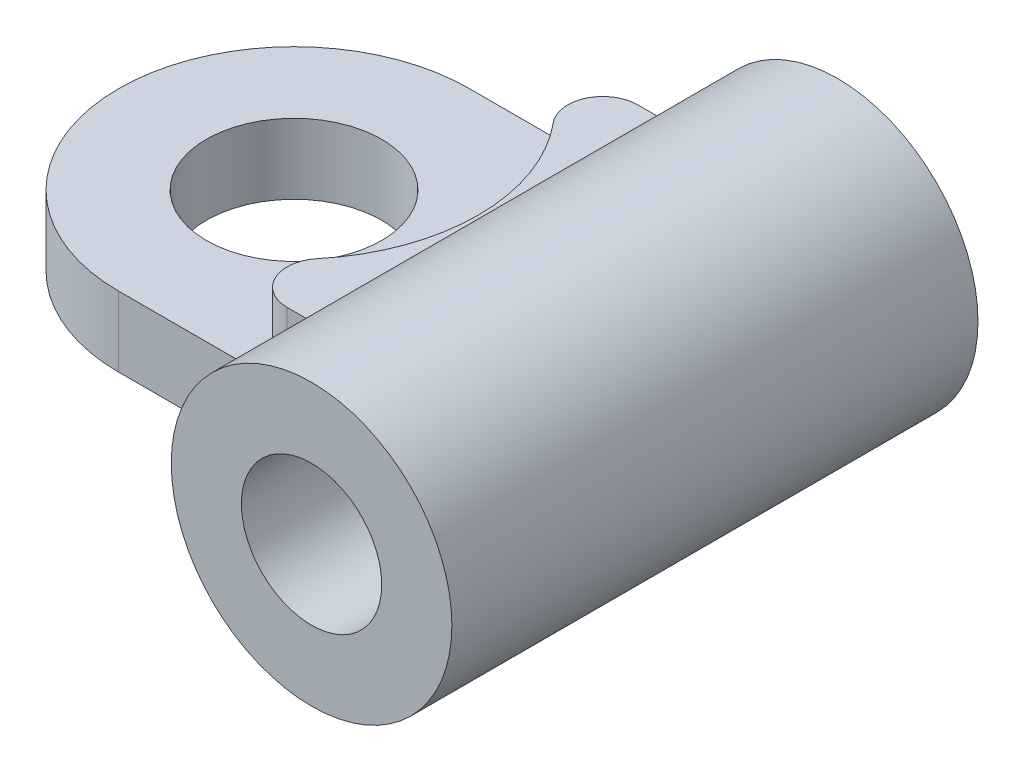
ISO-10303-21;
HEADER;
FILE_DESCRIPTION(('STEP AP214'),'2;1');
FILE_NAME('part.step','',(''),(''),'','','');
FILE_SCHEMA(('AUTOMOTIVE_DESIGN { 1 0 10303 214 1 1 1 1 }'));
ENDSEC;
DATA;
#1=APPLICATION_CONTEXT('core data for automotive mechanical design processes');
#2=APPLICATION_PROTOCOL_DEFINITION('international standard','automotive_design',2000,#1);
#3=PRODUCT_CONTEXT('',#1,'mechanical');
#4=PRODUCT('Part','Part','',(#3));
#5=PRODUCT_RELATED_PRODUCT_CATEGORY('part','',(#4));
#6=PRODUCT_DEFINITION_FORMATION('','',#4);
#7=PRODUCT_DEFINITION_CONTEXT('part definition',#1,'design');
#8=PRODUCT_DEFINITION('design','',#6,#7);
#9=PRODUCT_DEFINITION_SHAPE('','',#8);
#10=(LENGTH_UNIT() NAMED_UNIT(*) SI_UNIT(.MILLI.,.METRE.));
#11=(NAMED_UNIT(*) PLANE_ANGLE_UNIT() SI_UNIT($,.RADIAN.));
#12=(NAMED_UNIT(*) SI_UNIT($,.STERADIAN.) SOLID_ANGLE_UNIT());
#13=UNCERTAINTY_MEASURE_WITH_UNIT(LENGTH_MEASURE(1.E-05),#10,'distance_accuracy_value','');
#14=(GEOMETRIC_REPRESENTATION_CONTEXT(3) GLOBAL_UNCERTAINTY_ASSIGNED_CONTEXT((#13)) GLOBAL_UNIT_ASSIGNED_CONTEXT((#10,
#11,#12)) REPRESENTATION_CONTEXT('',''));
#15=CARTESIAN_POINT('',(0.,0.,0.));
#16=DIRECTION('',(0.,0.,1.));
#17=DIRECTION('',(1.,0.,0.));
#18=AXIS2_PLACEMENT_3D('',#15,#16,#17);
#19=CARTESIAN_POINT('',(-18.,4.,13.));
#20=DIRECTION('',(0.,-1.,0.));
#21=DIRECTION('',(0.,0.,-1.));
#22=AXIS2_PLACEMENT_3D('',#19,#20,#21);
#23=CYLINDRICAL_SURFACE('',#22,10.);
#24=CARTESIAN_POINT('',(-18.,0.,13.));
#25=DIRECTION('',(0.,1.,0.));
#26=DIRECTION('',(0.,0.,1.));
#27=AXIS2_PLACEMENT_3D('',#24,#25,#26);
#28=CIRCLE('',#27,10.);
#29=CARTESIAN_POINT('',(-18.,0.,3.));
#30=VERTEX_POINT('',#29);
#31=CARTESIAN_POINT('',(-18.,0.,23.));
#32=VERTEX_POINT('',#31);
#33=EDGE_CURVE('E111',#30,#32,#28,.T.);
#34=ORIENTED_EDGE('',*,*,#33,.F.);
#35=DIRECTION('',(0.,-1.,0.));
#36=VECTOR('',#35,1.);
#37=CARTESIAN_POINT('',(-18.,4.,3.));
#38=LINE('',#37,#36);
#39=CARTESIAN_POINT('',(-18.,-4.,3.));
#40=VERTEX_POINT('',#39);
#41=EDGE_CURVE('E120',#30,#40,#38,.T.);
#42=ORIENTED_EDGE('',*,*,#41,.T.);
#43=CARTESIAN_POINT('',(-18.,-4.,13.));
#44=DIRECTION('',(0.,1.,0.));
#45=DIRECTION('',(0.,0.,1.));
#46=AXIS2_PLACEMENT_3D('',#43,#44,#45);
#47=CIRCLE('',#46,10.);
#48=CARTESIAN_POINT('',(-18.,-4.,23.));
#49=VERTEX_POINT('',#48);
#50=EDGE_CURVE('E181',#40,#49,#47,.T.);
#51=ORIENTED_EDGE('',*,*,#50,.T.);
#52=DIRECTION('',(0.,-1.,0.));
#53=VECTOR('',#52,1.);
#54=CARTESIAN_POINT('',(-18.,4.,23.));
#55=LINE('',#54,#53);
#56=EDGE_CURVE('E115',#32,#49,#55,.T.);
#57=ORIENTED_EDGE('',*,*,#56,.F.);
#58=EDGE_LOOP('',(#34,#42,#51,#57));
#59=FACE_BOUND('',#58,.T.);
#60=ADVANCED_FACE('F48',(#59),#23,.T.);
#61=CARTESIAN_POINT('',(0.,4.,23.));
#62=DIRECTION('',(0.,0.,-1.));
#63=DIRECTION('',(-1.,0.,0.));
#64=AXIS2_PLACEMENT_3D('',#61,#62,#63);
#65=PLANE('',#64);
#66=DIRECTION('',(1.,0.,0.));
#67=VECTOR('',#66,1.);
#68=CARTESIAN_POINT('',(0.,4.,23.));
#69=LINE('',#68,#67);
#70=CARTESIAN_POINT('',(-8.39531364385073,4.,23.));
#71=VERTEX_POINT('',#70);
#72=CARTESIAN_POINT('',(-5.,4.,23.));
#73=VERTEX_POINT('',#72);
#74=EDGE_CURVE('E171',#71,#73,#69,.T.);
#75=ORIENTED_EDGE('',*,*,#74,.F.);
#76=DIRECTION('',(0.,1.,0.));
#77=VECTOR('',#76,1.);
#78=CARTESIAN_POINT('',(-8.39531364385073,4.,23.));
#79=LINE('',#78,#77);
#80=CARTESIAN_POINT('',(-8.39531364385073,0.,23.));
#81=VERTEX_POINT('',#80);
#82=EDGE_CURVE('E114',#71,#81,#79,.F.);
#83=ORIENTED_EDGE('',*,*,#82,.T.);
#84=DIRECTION('',(1.,0.,0.));
#85=VECTOR('',#84,1.);
#86=CARTESIAN_POINT('',(0.,0.,23.));
#87=LINE('',#86,#85);
#88=EDGE_CURVE('E122',#32,#81,#87,.T.);
#89=ORIENTED_EDGE('',*,*,#88,.F.);
#90=ORIENTED_EDGE('',*,*,#56,.T.);
#91=DIRECTION('',(1.,0.,0.));
#92=VECTOR('',#91,1.);
#93=CARTESIAN_POINT('',(0.,-4.,23.));
#94=LINE('',#93,#92);
#95=CARTESIAN_POINT('',(-5.,-4.,23.));
#96=VERTEX_POINT('',#95);
#97=EDGE_CURVE('E183',#49,#96,#94,.T.);
#98=ORIENTED_EDGE('',*,*,#97,.T.);
#99=DIRECTION('',(0.,-1.,0.));
#100=VECTOR('',#99,1.);
#101=CARTESIAN_POINT('',(-5.,4.,23.));
#102=LINE('',#101,#100);
#103=EDGE_CURVE('E132',#73,#96,#102,.T.);
#104=ORIENTED_EDGE('',*,*,#103,.F.);
#105=EDGE_LOOP('',(#75,#83,#89,#90,#98,#104));
#106=FACE_BOUND('',#105,.T.);
#107=ADVANCED_FACE('F174',(#106),#65,.F.);
#108=CARTESIAN_POINT('',(-5.,4.,0.));
#109=DIRECTION('',(-1.,0.,0.));
#110=DIRECTION('',(0.,0.,1.));
#111=AXIS2_PLACEMENT_3D('',#108,#109,#110);
#112=PLANE('',#111);
#113=DIRECTION('',(0.,0.,-1.));
#114=VECTOR('',#113,1.);
#115=CARTESIAN_POINT('',(-5.,-4.,0.));
#116=LINE('',#115,#114);
#117=CARTESIAN_POINT('',(-5.,-4.,3.));
#118=VERTEX_POINT('',#117);
#119=EDGE_CURVE('E178',#96,#118,#116,.T.);
#120=ORIENTED_EDGE('',*,*,#119,.T.);
#121=DIRECTION('',(0.,-1.,0.));
#122=VECTOR('',#121,1.);
#123=CARTESIAN_POINT('',(-5.,4.,3.));
#124=LINE('',#123,#122);
#125=CARTESIAN_POINT('',(-5.,4.,3.));
#126=VERTEX_POINT('',#125);
#127=EDGE_CURVE('E129',#126,#118,#124,.T.);
#128=ORIENTED_EDGE('',*,*,#127,.F.);
#129=DIRECTION('',(0.,0.,-1.));
#130=VECTOR('',#129,1.);
#131=CARTESIAN_POINT('',(-5.,4.,0.));
#132=LINE('',#131,#130);
#133=EDGE_CURVE('E134',#73,#126,#132,.T.);
#134=ORIENTED_EDGE('',*,*,#133,.F.);
#135=ORIENTED_EDGE('',*,*,#103,.T.);
#136=EDGE_LOOP('',(#120,#128,#134,#135));
#137=FACE_BOUND('',#136,.T.);
#138=ADVANCED_FACE('F188',(#137),#112,.F.);
#139=CARTESIAN_POINT('',(0.,4.,3.));
#140=DIRECTION('',(0.,0.,-1.));
#141=DIRECTION('',(-1.,0.,0.));
#142=AXIS2_PLACEMENT_3D('',#139,#140,#141);
#143=PLANE('',#142);
#144=DIRECTION('',(1.,0.,0.));
#145=VECTOR('',#144,1.);
#146=CARTESIAN_POINT('',(0.,0.,3.));
#147=LINE('',#146,#145);
#148=CARTESIAN_POINT('',(-8.39531364385073,0.,3.));
#149=VERTEX_POINT('',#148);
#150=EDGE_CURVE('E63',#30,#149,#147,.T.);
#151=ORIENTED_EDGE('',*,*,#150,.T.);
#152=DIRECTION('',(0.,-1.,0.));
#153=VECTOR('',#152,1.);
#154=CARTESIAN_POINT('',(-8.39531364385073,4.,3.));
#155=LINE('',#154,#153);
#156=CARTESIAN_POINT('',(-8.39531364385073,4.,3.));
#157=VERTEX_POINT('',#156);
#158=EDGE_CURVE('E67',#149,#157,#155,.F.);
#159=ORIENTED_EDGE('',*,*,#158,.T.);
#160=DIRECTION('',(1.,0.,0.));
#161=VECTOR('',#160,1.);
#162=CARTESIAN_POINT('',(0.,4.,3.));
#163=LINE('',#162,#161);
#164=EDGE_CURVE('E130',#157,#126,#163,.T.);
#165=ORIENTED_EDGE('',*,*,#164,.T.);
#166=ORIENTED_EDGE('',*,*,#127,.T.);
#167=DIRECTION('',(1.,0.,0.));
#168=VECTOR('',#167,1.);
#169=CARTESIAN_POINT('',(0.,-4.,3.));
#170=LINE('',#169,#168);
#171=EDGE_CURVE('E128',#40,#118,#170,.T.);
#172=ORIENTED_EDGE('',*,*,#171,.F.);
#173=ORIENTED_EDGE('',*,*,#41,.F.);
#174=EDGE_LOOP('',(#151,#159,#165,#166,#172,#173));
#175=FACE_BOUND('',#174,.T.);
#176=ADVANCED_FACE('F126',(#175),#143,.T.);
#177=CARTESIAN_POINT('',(0.,4.,0.));
#178=DIRECTION('',(0.,1.,0.));
#179=DIRECTION('',(0.,0.,1.));
#180=AXIS2_PLACEMENT_3D('',#177,#178,#179);
#181=PLANE('',#180);
#182=CARTESIAN_POINT('',(-18.,4.,13.));
#183=DIRECTION('',(0.,1.,0.));
#184=DIRECTION('',(0.,0.,1.));
#185=AXIS2_PLACEMENT_3D('',#182,#183,#184);
#186=CIRCLE('',#185,10.5);
#187=CARTESIAN_POINT('',(-9.93206346083461,4.,19.72));
#188=VERTEX_POINT('',#187);
#189=CARTESIAN_POINT('',(-9.93206346083461,4.,6.28));
#190=VERTEX_POINT('',#189);
#191=EDGE_CURVE('E163',#188,#190,#186,.T.);
#192=ORIENTED_EDGE('',*,*,#191,.F.);
#193=CARTESIAN_POINT('',(-8.39531364385073,4.,21.));
#194=DIRECTION('',(0.,1.,0.));
#195=DIRECTION('',(0.,0.,1.));
#196=AXIS2_PLACEMENT_3D('',#193,#194,#195);
#197=CIRCLE('',#196,2.);
#198=EDGE_CURVE('E151',#188,#71,#197,.T.);
#199=ORIENTED_EDGE('',*,*,#198,.T.);
#200=ORIENTED_EDGE('',*,*,#74,.T.);
#201=ORIENTED_EDGE('',*,*,#133,.T.);
#202=ORIENTED_EDGE('',*,*,#164,.F.);
#203=CARTESIAN_POINT('',(-8.39531364385073,4.,5.));
#204=DIRECTION('',(0.,1.,0.));
#205=DIRECTION('',(0.,0.,1.));
#206=AXIS2_PLACEMENT_3D('',#203,#204,#205);
#207=CIRCLE('',#206,2.);
#208=EDGE_CURVE('E149',#157,#190,#207,.T.);
#209=ORIENTED_EDGE('',*,*,#208,.T.);
#210=EDGE_LOOP('',(#192,#199,#200,#201,#202,#209));
#211=FACE_BOUND('',#210,.T.);
#212=ADVANCED_FACE('F169',(#211),#181,.T.);
#213=CARTESIAN_POINT('',(0.,-4.,0.));
#214=DIRECTION('',(0.,1.,0.));
#215=DIRECTION('',(0.,0.,1.));
#216=AXIS2_PLACEMENT_3D('',#213,#214,#215);
#217=PLANE('',#216);
#218=CARTESIAN_POINT('',(-18.,-4.,13.));
#219=DIRECTION('',(0.,1.,0.));
#220=DIRECTION('',(0.,0.,1.));
#221=AXIS2_PLACEMENT_3D('',#218,#219,#220);
#222=CIRCLE('',#221,5.);
#223=CARTESIAN_POINT('',(-18.,-4.,18.));
#224=VERTEX_POINT('',#223);
#225=EDGE_CURVE('E228',#224,#224,#222,.T.);
#226=ORIENTED_EDGE('',*,*,#225,.T.);
#227=EDGE_LOOP('',(#226));
#228=FACE_BOUND('',#227,.T.);
#229=ORIENTED_EDGE('',*,*,#50,.F.);
#230=ORIENTED_EDGE('',*,*,#171,.T.);
#231=ORIENTED_EDGE('',*,*,#119,.F.);
#232=ORIENTED_EDGE('',*,*,#97,.F.);
#233=EDGE_LOOP('',(#229,#230,#231,#232));
#234=FACE_BOUND('',#233,.T.);
#235=ADVANCED_FACE('F191',(#228,#234),#217,.F.);
#236=CARTESIAN_POINT('',(-18.,0.,13.));
#237=DIRECTION('',(0.,1.,0.));
#238=DIRECTION('',(0.,0.,1.));
#239=AXIS2_PLACEMENT_3D('',#236,#237,#238);
#240=PLANE('',#239);
#241=CARTESIAN_POINT('',(-18.,0.,13.));
#242=DIRECTION('',(0.,1.,0.));
#243=DIRECTION('',(0.,0.,1.));
#244=AXIS2_PLACEMENT_3D('',#241,#242,#243);
#245=CIRCLE('',#244,5.);
#246=CARTESIAN_POINT('',(-18.,0.,18.));
#247=VERTEX_POINT('',#246);
#248=EDGE_CURVE('E231',#247,#247,#245,.T.);
#249=ORIENTED_EDGE('',*,*,#248,.F.);
#250=EDGE_LOOP('',(#249));
#251=FACE_BOUND('',#250,.T.);
#252=ORIENTED_EDGE('',*,*,#88,.T.);
#253=CARTESIAN_POINT('',(-8.39531364385073,0.,21.));
#254=DIRECTION('',(0.,1.,0.));
#255=DIRECTION('',(0.,0.,1.));
#256=AXIS2_PLACEMENT_3D('',#253,#254,#255);
#257=CIRCLE('',#256,2.);
#258=CARTESIAN_POINT('',(-9.93206346083461,0.,19.72));
#259=VERTEX_POINT('',#258);
#260=EDGE_CURVE('E56',#81,#259,#257,.F.);
#261=ORIENTED_EDGE('',*,*,#260,.T.);
#262=CARTESIAN_POINT('',(-18.,0.,13.));
#263=DIRECTION('',(0.,1.,0.));
#264=DIRECTION('',(0.,0.,1.));
#265=AXIS2_PLACEMENT_3D('',#262,#263,#264);
#266=CIRCLE('',#265,10.5);
#267=CARTESIAN_POINT('',(-9.93206346083461,0.,6.28));
#268=VERTEX_POINT('',#267);
#269=EDGE_CURVE('E123',#259,#268,#266,.T.);
#270=ORIENTED_EDGE('',*,*,#269,.T.);
#271=CARTESIAN_POINT('',(-8.39531364385073,0.,5.));
#272=DIRECTION('',(0.,1.,0.));
#273=DIRECTION('',(0.,0.,1.));
#274=AXIS2_PLACEMENT_3D('',#271,#272,#273);
#275=CIRCLE('',#274,2.);
#276=EDGE_CURVE('E12',#268,#149,#275,.F.);
#277=ORIENTED_EDGE('',*,*,#276,.T.);
#278=ORIENTED_EDGE('',*,*,#150,.F.);
#279=ORIENTED_EDGE('',*,*,#33,.T.);
#280=EDGE_LOOP('',(#252,#261,#270,#277,#278,#279));
#281=FACE_BOUND('',#280,.T.);
#282=ADVANCED_FACE('F110',(#251,#281),#240,.T.);
#283=CARTESIAN_POINT('',(-18.,0.,13.));
#284=DIRECTION('',(0.,1.,0.));
#285=DIRECTION('',(0.,0.,1.));
#286=AXIS2_PLACEMENT_3D('',#283,#284,#285);
#287=CYLINDRICAL_SURFACE('',#286,10.5);
#288=ORIENTED_EDGE('',*,*,#269,.F.);
#289=DIRECTION('',(0.,1.,0.));
#290=VECTOR('',#289,1.);
#291=CARTESIAN_POINT('',(-9.93206346083461,0.,19.72));
#292=LINE('',#291,#290);
#293=EDGE_CURVE('E147',#259,#188,#292,.T.);
#294=ORIENTED_EDGE('',*,*,#293,.T.);
#295=ORIENTED_EDGE('',*,*,#191,.T.);
#296=DIRECTION('',(0.,1.,0.));
#297=VECTOR('',#296,1.);
#298=CARTESIAN_POINT('',(-9.93206346083461,0.,6.28));
#299=LINE('',#298,#297);
#300=EDGE_CURVE('E144',#190,#268,#299,.F.);
#301=ORIENTED_EDGE('',*,*,#300,.T.);
#302=EDGE_LOOP('',(#288,#294,#295,#301));
#303=FACE_BOUND('',#302,.T.);
#304=ADVANCED_FACE('F159',(#303),#287,.F.);
#305=CARTESIAN_POINT('',(-8.39531364385073,0.,21.));
#306=DIRECTION('',(0.,1.,0.));
#307=DIRECTION('',(0.,0.,1.));
#308=AXIS2_PLACEMENT_3D('',#305,#306,#307);
#309=CYLINDRICAL_SURFACE('',#308,2.);
#310=ORIENTED_EDGE('',*,*,#198,.F.);
#311=ORIENTED_EDGE('',*,*,#293,.F.);
#312=ORIENTED_EDGE('',*,*,#260,.F.);
#313=ORIENTED_EDGE('',*,*,#82,.F.);
#314=EDGE_LOOP('',(#310,#311,#312,#313));
#315=FACE_BOUND('',#314,.T.);
#316=ADVANCED_FACE('F166',(#315),#309,.T.);
#317=CARTESIAN_POINT('',(-8.39531364385073,0.,5.));
#318=DIRECTION('',(0.,1.,0.));
#319=DIRECTION('',(0.,0.,1.));
#320=AXIS2_PLACEMENT_3D('',#317,#318,#319);
#321=CYLINDRICAL_SURFACE('',#320,2.);
#322=ORIENTED_EDGE('',*,*,#208,.F.);
#323=ORIENTED_EDGE('',*,*,#158,.F.);
#324=ORIENTED_EDGE('',*,*,#276,.F.);
#325=ORIENTED_EDGE('',*,*,#300,.F.);
#326=EDGE_LOOP('',(#322,#323,#324,#325));
#327=FACE_BOUND('',#326,.T.);
#328=ADVANCED_FACE('F50',(#327),#321,.T.);
#329=CARTESIAN_POINT('',(-18.,-4.,13.));
#330=DIRECTION('',(0.,1.,0.));
#331=DIRECTION('',(0.,0.,1.));
#332=AXIS2_PLACEMENT_3D('',#329,#330,#331);
#333=CYLINDRICAL_SURFACE('',#332,5.);
#334=ORIENTED_EDGE('',*,*,#225,.F.);
#335=EDGE_LOOP('',(#334));
#336=FACE_BOUND('',#335,.T.);
#337=ORIENTED_EDGE('',*,*,#248,.T.);
#338=EDGE_LOOP('',(#337));
#339=FACE_BOUND('',#338,.T.);
#340=ADVANCED_FACE('F216',(#336,#339),#333,.F.);
#341=CLOSED_SHELL('',(#60,#107,#138,#176,#212,#235,#282,#304,#316,#328,#340));
#342=MANIFOLD_SOLID_BREP('B2',#341);
#343=CARTESIAN_POINT('',(0.,0.,30.));
#344=DIRECTION('',(0.,0.,1.));
#345=DIRECTION('',(1.,0.,0.));
#346=AXIS2_PLACEMENT_3D('',#343,#344,#345);
#347=PLANE('',#346);
#348=CARTESIAN_POINT('',(0.,0.,30.));
#349=DIRECTION('',(0.,0.,1.));
#350=DIRECTION('',(1.,0.,0.));
#351=AXIS2_PLACEMENT_3D('',#348,#349,#350);
#352=CIRCLE('',#351,8.);
#353=CARTESIAN_POINT('',(8.,0.,30.));
#354=VERTEX_POINT('',#353);
#355=EDGE_CURVE('E332',#354,#354,#352,.T.);
#356=ORIENTED_EDGE('',*,*,#355,.T.);
#357=EDGE_LOOP('',(#356));
#358=FACE_BOUND('',#357,.T.);
#359=CARTESIAN_POINT('',(0.,0.,30.));
#360=DIRECTION('',(0.,0.,1.));
#361=DIRECTION('',(1.,0.,0.));
#362=AXIS2_PLACEMENT_3D('',#359,#360,#361);
#363=CIRCLE('',#362,4.);
#364=CARTESIAN_POINT('',(4.,0.,30.));
#365=VERTEX_POINT('',#364);
#366=EDGE_CURVE('E348',#365,#365,#363,.T.);
#367=ORIENTED_EDGE('',*,*,#366,.F.);
#368=EDGE_LOOP('',(#367));
#369=FACE_BOUND('',#368,.T.);
#370=ADVANCED_FACE('F308',(#358,#369),#347,.T.);
#371=CARTESIAN_POINT('',(0.,0.,0.));
#372=DIRECTION('',(0.,0.,1.));
#373=DIRECTION('',(1.,0.,0.));
#374=AXIS2_PLACEMENT_3D('',#371,#372,#373);
#375=PLANE('',#374);
#376=CARTESIAN_POINT('',(0.,0.,0.));
#377=DIRECTION('',(0.,0.,1.));
#378=DIRECTION('',(1.,0.,0.));
#379=AXIS2_PLACEMENT_3D('',#376,#377,#378);
#380=CIRCLE('',#379,8.);
#381=CARTESIAN_POINT('',(8.,0.,0.));
#382=VERTEX_POINT('',#381);
#383=EDGE_CURVE('E346',#382,#382,#380,.T.);
#384=ORIENTED_EDGE('',*,*,#383,.F.);
#385=EDGE_LOOP('',(#384));
#386=FACE_BOUND('',#385,.T.);
#387=CARTESIAN_POINT('',(0.,0.,0.));
#388=DIRECTION('',(0.,0.,1.));
#389=DIRECTION('',(1.,0.,0.));
#390=AXIS2_PLACEMENT_3D('',#387,#388,#389);
#391=CIRCLE('',#390,4.);
#392=CARTESIAN_POINT('',(4.,0.,0.));
#393=VERTEX_POINT('',#392);
#394=EDGE_CURVE('E335',#393,#393,#391,.T.);
#395=ORIENTED_EDGE('',*,*,#394,.T.);
#396=EDGE_LOOP('',(#395));
#397=FACE_BOUND('',#396,.T.);
#398=ADVANCED_FACE('F340',(#386,#397),#375,.F.);
#399=CARTESIAN_POINT('',(0.,0.,30.));
#400=DIRECTION('',(0.,0.,-1.));
#401=DIRECTION('',(-1.,0.,0.));
#402=AXIS2_PLACEMENT_3D('',#399,#400,#401);
#403=CYLINDRICAL_SURFACE('',#402,8.);
#404=DIRECTION('',(0.,0.,-1.));
#405=VECTOR('',#404,1.);
#406=CARTESIAN_POINT('',(-8.,0.,30.));
#407=LINE('',#406,#405);
#408=CARTESIAN_POINT('',(-8.,0.,9.79843788128358));
#409=VERTEX_POINT('',#408);
#410=CARTESIAN_POINT('',(-8.,0.,16.2015621187164));
#411=VERTEX_POINT('',#410);
#412=EDGE_CURVE('E321',#409,#411,#407,.F.);
#413=ORIENTED_EDGE('',*,*,#412,.F.);
#414=CARTESIAN_POINT('',(-8.,0.,9.79843788128358));
#415=CARTESIAN_POINT('',(-8.00001043223072,0.0734846153092185,9.79842671234697));
#416=CARTESIAN_POINT('',(-7.99898775979152,0.14696251264809,9.80160011603849));
#417=CARTESIAN_POINT('',(-7.99495385706025,0.293300571027976,9.81422977446037));
#418=CARTESIAN_POINT('',(-7.99194320452415,0.36616090531872,9.82368420377487));
#419=CARTESIAN_POINT('',(-7.98402666782739,0.510415760017053,9.84873983653048));
#420=CARTESIAN_POINT('',(-7.97912836136697,0.581814954217892,9.86431646823204));
#421=CARTESIAN_POINT('',(-7.96758824041247,0.722880268190753,9.90143738997425));
#422=CARTESIAN_POINT('',(-7.96094637706869,0.79254633934553,9.92298184721798));
#423=CARTESIAN_POINT('',(-7.93868462314367,0.998092875941812,9.99624160132192));
#424=CARTESIAN_POINT('',(-7.92071562268809,1.13074190173603,10.0566221066744));
#425=CARTESIAN_POINT('',(-7.88047671625616,1.38368064738618,10.1981042680443));
#426=CARTESIAN_POINT('',(-7.85820450220837,1.50396368133599,10.2792170515984));
#427=CARTESIAN_POINT('',(-7.81139992706516,1.73076940803598,10.4600780383705));
#428=CARTESIAN_POINT('',(-7.78684987432858,1.83716569442782,10.5599796039312));
#429=CARTESIAN_POINT('',(-7.73790294463824,2.03349961400553,10.7748030501091));
#430=CARTESIAN_POINT('',(-7.71350611708934,2.12343217786712,10.8897295384227));
#431=CARTESIAN_POINT('',(-7.66419377335843,2.29544150579876,11.1453080790518));
#432=CARTESIAN_POINT('',(-7.6395366136729,2.37545155105522,11.2873992198908));
#433=CARTESIAN_POINT('',(-7.59506780889607,2.51400937112894,11.5823697099761));
#434=CARTESIAN_POINT('',(-7.5752585524318,2.5725465730458,11.7352543297071));
#435=CARTESIAN_POINT('',(-7.53994951556735,2.67440819277479,12.0679646659659));
#436=CARTESIAN_POINT('',(-7.52530839128871,2.71488269291191,12.2487563046116));
#437=CARTESIAN_POINT('',(-7.50546299332005,2.769268250287,12.6148232890645));
#438=CARTESIAN_POINT('',(-7.50026382841137,2.78316492722066,12.8001010072618));
#439=CARTESIAN_POINT('',(-7.49973363563638,2.78460684582733,13.1873783837378));
#440=CARTESIAN_POINT('',(-7.50532504668252,2.76968874348657,13.3893941894454));
#441=CARTESIAN_POINT('',(-7.52770816797064,2.70825908256459,13.788019854995));
#442=CARTESIAN_POINT('',(-7.54450290710604,2.66173898011235,13.9846282379334));
#443=CARTESIAN_POINT('',(-7.58756844320113,2.53637766852895,14.3668721403212));
#444=CARTESIAN_POINT('',(-7.61386467514037,2.45744962702242,14.5524766355926));
#445=CARTESIAN_POINT('',(-7.67272999504764,2.26695758570904,14.9051005050596));
#446=CARTESIAN_POINT('',(-7.70529491621255,2.15541523924235,15.0721321089652));
#447=CARTESIAN_POINT('',(-7.76884625434005,1.91289197512922,15.3651335592848));
#448=CARTESIAN_POINT('',(-7.79968684729215,1.78478096724039,15.4935005849231));
#449=CARTESIAN_POINT('',(-7.85841880049783,1.50516246278396,15.7225644136661));
#450=CARTESIAN_POINT('',(-7.88631277235355,1.35367598210508,15.8232858479126));
#451=CARTESIAN_POINT('',(-7.9314324582648,1.05452456297624,15.9798792478961));
#452=CARTESIAN_POINT('',(-7.94960014354358,0.909229552237337,16.0400278452479));
#453=CARTESIAN_POINT('',(-7.97815390026862,0.60953700119235,16.1328922106307));
#454=CARTESIAN_POINT('',(-7.98855782620639,0.455161232450323,16.1656709425503));
#455=CARTESIAN_POINT('',(-7.99626502871929,0.249517302805751,16.1898746285978));
#456=CARTESIAN_POINT('',(-7.99766432222422,0.199685184935042,16.1942581916591));
#457=CARTESIAN_POINT('',(-7.99953050574525,0.0999106929080617,16.2000975408687));
#458=CARTESIAN_POINT('',(-7.99999885503656,0.0499686143551364,16.2015579092135));
#459=CARTESIAN_POINT('',(-8.,0.,16.2015621187164));
#460=B_SPLINE_CURVE_WITH_KNOTS('',3,(#414,#415,#416,#417,#418,#419,#420,#421,#422,#423,#424,
#425,#426,#427,#428,#429,#430,#431,#432,#433,#434,#435,#436,#437,#438,#439,#440,#441,#442,#443,
#444,#445,#446,#447,#448,#449,#450,#451,#452,#453,#454,#455,#456,#457,#458,#459),.UNSPECIFIED.,
.F.,.F.,(4,2,2,2,2,2,2,2,2,2,2,2,2,2,2,2,2,2,2,2,2,2,4),(0.,0.22036693351831,0.440669851150217,
0.660097456769867,0.879531210806944,1.31773585687829,1.75617619413554,2.19836415541642,
2.64068804207602,3.13347418047428,3.62650263458408,4.18171469430231,4.73722707440654,
5.34233403141749,5.94760464941243,6.55450769602238,7.16100871800866,7.70964499504386,
8.25779086005692,8.73011402137655,9.20134759443938,9.35141244091421,9.50124187140293),.UNSPECIFIED.);
#461=EDGE_CURVE('E46',#409,#411,#460,.T.);
#462=ORIENTED_EDGE('',*,*,#461,.T.);
#463=EDGE_LOOP('',(#413,#462));
#464=FACE_BOUND('',#463,.T.);
#465=ORIENTED_EDGE('',*,*,#355,.F.);
#466=EDGE_LOOP('',(#465));
#467=FACE_BOUND('',#466,.T.);
#468=ORIENTED_EDGE('',*,*,#383,.T.);
#469=EDGE_LOOP('',(#468));
#470=FACE_BOUND('',#469,.T.);
#471=ADVANCED_FACE('F310',(#464,#467,#470),#403,.T.);
#472=CARTESIAN_POINT('',(0.,0.,30.));
#473=DIRECTION('',(0.,0.,-1.));
#474=DIRECTION('',(-1.,0.,0.));
#475=AXIS2_PLACEMENT_3D('',#472,#473,#474);
#476=CYLINDRICAL_SURFACE('',#475,4.);
#477=ORIENTED_EDGE('',*,*,#366,.T.);
#478=EDGE_LOOP('',(#477));
#479=FACE_BOUND('',#478,.T.);
#480=ORIENTED_EDGE('',*,*,#394,.F.);
#481=EDGE_LOOP('',(#480));
#482=FACE_BOUND('',#481,.T.);
#483=ADVANCED_FACE('F339',(#479,#482),#476,.F.);
#484=CARTESIAN_POINT('',(-18.,0.,13.));
#485=DIRECTION('',(0.,1.,0.));
#486=DIRECTION('',(0.,0.,1.));
#487=AXIS2_PLACEMENT_3D('',#484,#485,#486);
#488=CYLINDRICAL_SURFACE('',#487,10.5);
#489=CARTESIAN_POINT('',(-18.,0.,13.));
#490=DIRECTION('',(0.,1.,0.));
#491=DIRECTION('',(0.,0.,1.));
#492=AXIS2_PLACEMENT_3D('',#489,#490,#491);
#493=CIRCLE('',#492,10.5);
#494=EDGE_CURVE('E327',#411,#409,#493,.T.);
#495=ORIENTED_EDGE('',*,*,#494,.F.);
#496=ORIENTED_EDGE('',*,*,#461,.F.);
#497=EDGE_LOOP('',(#495,#496));
#498=FACE_BOUND('',#497,.T.);
#499=ADVANCED_FACE('F334',(#498),#488,.F.);
#500=CARTESIAN_POINT('',(-18.,0.,13.));
#501=DIRECTION('',(0.,1.,0.));
#502=DIRECTION('',(0.,0.,1.));
#503=AXIS2_PLACEMENT_3D('',#500,#501,#502);
#504=PLANE('',#503);
#505=ORIENTED_EDGE('',*,*,#412,.T.);
#506=ORIENTED_EDGE('',*,*,#494,.T.);
#507=EDGE_LOOP('',(#505,#506));
#508=FACE_BOUND('',#507,.T.);
#509=ADVANCED_FACE('F330',(#508),#504,.T.);
#510=CLOSED_SHELL('',(#370,#398,#471,#483,#499,#509));
#511=MANIFOLD_SOLID_BREP('B6',#510);
#512=ADVANCED_BREP_SHAPE_REPRESENTATION('',(#18,#342,#511),#14);
#513=SHAPE_DEFINITION_REPRESENTATION(#9,#512);
ENDSEC;
END-ISO-10303-21;
